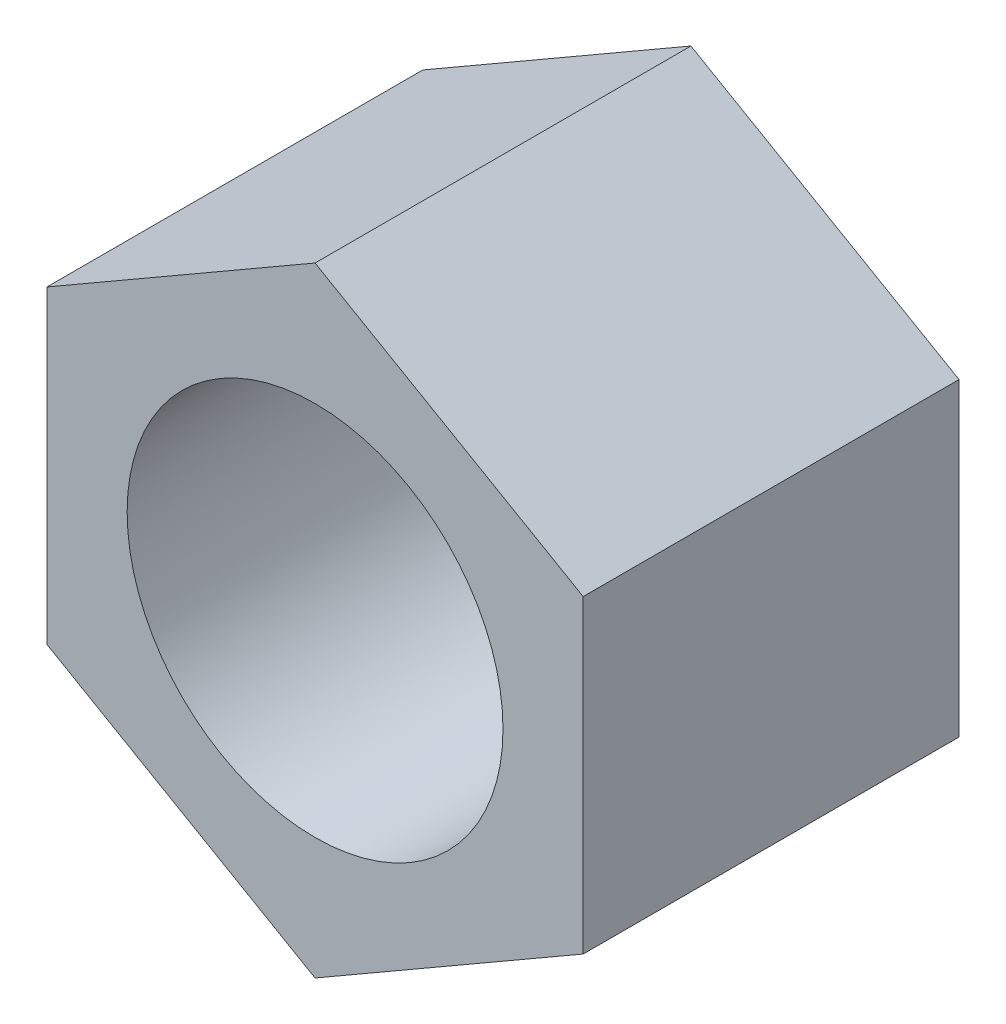
ISO-10303-21;
HEADER;
FILE_DESCRIPTION(('STEP AP214'),'2;1');
FILE_NAME('part.step','',(''),(''),'','','');
FILE_SCHEMA(('AUTOMOTIVE_DESIGN { 1 0 10303 214 1 1 1 1 }'));
ENDSEC;
DATA;
#1=APPLICATION_CONTEXT('core data for automotive mechanical design processes');
#2=APPLICATION_PROTOCOL_DEFINITION('international standard','automotive_design',2000,#1);
#3=PRODUCT_CONTEXT('',#1,'mechanical');
#4=PRODUCT('Part','Part','',(#3));
#5=PRODUCT_RELATED_PRODUCT_CATEGORY('part','',(#4));
#6=PRODUCT_DEFINITION_FORMATION('','',#4);
#7=PRODUCT_DEFINITION_CONTEXT('part definition',#1,'design');
#8=PRODUCT_DEFINITION('design','',#6,#7);
#9=PRODUCT_DEFINITION_SHAPE('','',#8);
#10=(LENGTH_UNIT() NAMED_UNIT(*) SI_UNIT(.MILLI.,.METRE.));
#11=(NAMED_UNIT(*) PLANE_ANGLE_UNIT() SI_UNIT($,.RADIAN.));
#12=(NAMED_UNIT(*) SI_UNIT($,.STERADIAN.) SOLID_ANGLE_UNIT());
#13=UNCERTAINTY_MEASURE_WITH_UNIT(LENGTH_MEASURE(1.E-05),#10,'distance_accuracy_value','');
#14=(GEOMETRIC_REPRESENTATION_CONTEXT(3) GLOBAL_UNCERTAINTY_ASSIGNED_CONTEXT((#13)) GLOBAL_UNIT_ASSIGNED_CONTEXT((#10,
#11,#12)) REPRESENTATION_CONTEXT('',''));
#15=CARTESIAN_POINT('',(0.,0.,0.));
#16=DIRECTION('',(0.,0.,1.));
#17=DIRECTION('',(1.,0.,0.));
#18=AXIS2_PLACEMENT_3D('',#15,#16,#17);
#19=CARTESIAN_POINT('',(0.,0.,6.));
#20=DIRECTION('',(0.,0.,1.));
#21=DIRECTION('',(1.,0.,0.));
#22=AXIS2_PLACEMENT_3D('',#19,#20,#21);
#23=PLANE('',#22);
#24=DIRECTION('',(0.866025403784442,-0.499999999999995,0.));
#25=VECTOR('',#24,1.);
#26=CARTESIAN_POINT('',(-4.28002451059541,-2.47107330333052,6.));
#27=LINE('',#26,#25);
#28=CARTESIAN_POINT('',(-4.28002451059541,-2.47107330333052,6.));
#29=VERTEX_POINT('',#28);
#30=CARTESIAN_POINT('',(0.,-4.94214660666094,6.));
#31=VERTEX_POINT('',#30);
#32=EDGE_CURVE('E131',#29,#31,#27,.T.);
#33=ORIENTED_EDGE('',*,*,#32,.T.);
#34=DIRECTION('',(0.866025403784438,0.500000000000001,0.));
#35=VECTOR('',#34,1.);
#36=CARTESIAN_POINT('',(0.,-4.94214660666094,6.));
#37=LINE('',#36,#35);
#38=CARTESIAN_POINT('',(4.28002451059544,-2.47107330333046,6.));
#39=VERTEX_POINT('',#38);
#40=EDGE_CURVE('E89',#31,#39,#37,.T.);
#41=ORIENTED_EDGE('',*,*,#40,.T.);
#42=DIRECTION('',(0.,1.,0.));
#43=VECTOR('',#42,1.);
#44=CARTESIAN_POINT('',(4.28002451059544,-2.47107330333046,6.));
#45=LINE('',#44,#43);
#46=CARTESIAN_POINT('',(4.28002451059543,2.47107330333049,6.));
#47=VERTEX_POINT('',#46);
#48=EDGE_CURVE('E102',#39,#47,#45,.T.);
#49=ORIENTED_EDGE('',*,*,#48,.T.);
#50=DIRECTION('',(-0.866025403784442,0.499999999999995,0.));
#51=VECTOR('',#50,1.);
#52=CARTESIAN_POINT('',(4.28002451059543,2.47107330333049,6.));
#53=LINE('',#52,#51);
#54=CARTESIAN_POINT('',(0.,4.94214660666094,6.));
#55=VERTEX_POINT('',#54);
#56=EDGE_CURVE('E96',#47,#55,#53,.T.);
#57=ORIENTED_EDGE('',*,*,#56,.T.);
#58=DIRECTION('',(-0.866025403784435,-0.500000000000007,0.));
#59=VECTOR('',#58,1.);
#60=CARTESIAN_POINT('',(0.,4.94214660666094,6.));
#61=LINE('',#60,#59);
#62=CARTESIAN_POINT('',(-4.28002451059546,2.47107330333043,6.));
#63=VERTEX_POINT('',#62);
#64=EDGE_CURVE('E100',#55,#63,#61,.T.);
#65=ORIENTED_EDGE('',*,*,#64,.T.);
#66=DIRECTION('',(0.,-1.,0.));
#67=VECTOR('',#66,1.);
#68=CARTESIAN_POINT('',(-4.28002451059546,2.47107330333043,6.));
#69=LINE('',#68,#67);
#70=EDGE_CURVE('E52',#63,#29,#69,.T.);
#71=ORIENTED_EDGE('',*,*,#70,.T.);
#72=EDGE_LOOP('',(#33,#41,#49,#57,#65,#71));
#73=FACE_BOUND('',#72,.T.);
#74=CARTESIAN_POINT('',(0.,0.,6.));
#75=DIRECTION('',(0.,0.,1.));
#76=DIRECTION('',(1.,0.,0.));
#77=AXIS2_PLACEMENT_3D('',#74,#75,#76);
#78=CIRCLE('',#77,3.);
#79=CARTESIAN_POINT('',(3.,0.,6.));
#80=VERTEX_POINT('',#79);
#81=EDGE_CURVE('E124',#80,#80,#78,.T.);
#82=ORIENTED_EDGE('',*,*,#81,.F.);
#83=EDGE_LOOP('',(#82));
#84=FACE_BOUND('',#83,.T.);
#85=ADVANCED_FACE('F35',(#73,#84),#23,.T.);
#86=CARTESIAN_POINT('',(0.,0.,0.));
#87=DIRECTION('',(0.,0.,1.));
#88=DIRECTION('',(1.,0.,0.));
#89=AXIS2_PLACEMENT_3D('',#86,#87,#88);
#90=PLANE('',#89);
#91=DIRECTION('',(0.866025403784442,-0.499999999999995,0.));
#92=VECTOR('',#91,1.);
#93=CARTESIAN_POINT('',(-4.28002451059541,-2.47107330333052,0.));
#94=LINE('',#93,#92);
#95=CARTESIAN_POINT('',(-4.28002451059541,-2.47107330333052,0.));
#96=VERTEX_POINT('',#95);
#97=CARTESIAN_POINT('',(0.,-4.94214660666094,0.));
#98=VERTEX_POINT('',#97);
#99=EDGE_CURVE('E120',#96,#98,#94,.T.);
#100=ORIENTED_EDGE('',*,*,#99,.F.);
#101=DIRECTION('',(0.,-1.,0.));
#102=VECTOR('',#101,1.);
#103=CARTESIAN_POINT('',(-4.28002451059546,2.47107330333043,0.));
#104=LINE('',#103,#102);
#105=CARTESIAN_POINT('',(-4.28002451059546,2.47107330333043,0.));
#106=VERTEX_POINT('',#105);
#107=EDGE_CURVE('E81',#106,#96,#104,.T.);
#108=ORIENTED_EDGE('',*,*,#107,.F.);
#109=DIRECTION('',(-0.866025403784435,-0.500000000000007,0.));
#110=VECTOR('',#109,1.);
#111=CARTESIAN_POINT('',(0.,4.94214660666094,0.));
#112=LINE('',#111,#110);
#113=CARTESIAN_POINT('',(0.,4.94214660666094,0.));
#114=VERTEX_POINT('',#113);
#115=EDGE_CURVE('E75',#114,#106,#112,.T.);
#116=ORIENTED_EDGE('',*,*,#115,.F.);
#117=DIRECTION('',(-0.866025403784442,0.499999999999995,0.));
#118=VECTOR('',#117,1.);
#119=CARTESIAN_POINT('',(4.28002451059543,2.47107330333049,0.));
#120=LINE('',#119,#118);
#121=CARTESIAN_POINT('',(4.28002451059543,2.47107330333049,0.));
#122=VERTEX_POINT('',#121);
#123=EDGE_CURVE('E110',#122,#114,#120,.T.);
#124=ORIENTED_EDGE('',*,*,#123,.F.);
#125=DIRECTION('',(0.,1.,0.));
#126=VECTOR('',#125,1.);
#127=CARTESIAN_POINT('',(4.28002451059544,-2.47107330333046,0.));
#128=LINE('',#127,#126);
#129=CARTESIAN_POINT('',(4.28002451059544,-2.47107330333046,0.));
#130=VERTEX_POINT('',#129);
#131=EDGE_CURVE('E126',#130,#122,#128,.T.);
#132=ORIENTED_EDGE('',*,*,#131,.F.);
#133=DIRECTION('',(0.866025403784438,0.500000000000001,0.));
#134=VECTOR('',#133,1.);
#135=CARTESIAN_POINT('',(0.,-4.94214660666094,0.));
#136=LINE('',#135,#134);
#137=EDGE_CURVE('E123',#98,#130,#136,.T.);
#138=ORIENTED_EDGE('',*,*,#137,.F.);
#139=EDGE_LOOP('',(#100,#108,#116,#124,#132,#138));
#140=FACE_BOUND('',#139,.T.);
#141=CARTESIAN_POINT('',(0.,0.,0.));
#142=DIRECTION('',(0.,0.,1.));
#143=DIRECTION('',(1.,0.,0.));
#144=AXIS2_PLACEMENT_3D('',#141,#142,#143);
#145=CIRCLE('',#144,3.);
#146=CARTESIAN_POINT('',(3.,0.,0.));
#147=VERTEX_POINT('',#146);
#148=EDGE_CURVE('E224',#147,#147,#145,.T.);
#149=ORIENTED_EDGE('',*,*,#148,.T.);
#150=EDGE_LOOP('',(#149));
#151=FACE_BOUND('',#150,.T.);
#152=ADVANCED_FACE('F140',(#140,#151),#90,.F.);
#153=CARTESIAN_POINT('',(-4.28002451059541,-2.47107330333052,6.));
#154=DIRECTION('',(0.499999999999995,0.866025403784441,0.));
#155=DIRECTION('',(-0.866025403784442,0.499999999999995,0.));
#156=AXIS2_PLACEMENT_3D('',#153,#154,#155);
#157=PLANE('',#156);
#158=ORIENTED_EDGE('',*,*,#99,.T.);
#159=DIRECTION('',(0.,0.,-1.));
#160=VECTOR('',#159,1.);
#161=CARTESIAN_POINT('',(0.,-4.94214660666094,6.));
#162=LINE('',#161,#160);
#163=EDGE_CURVE('E11',#31,#98,#162,.T.);
#164=ORIENTED_EDGE('',*,*,#163,.F.);
#165=ORIENTED_EDGE('',*,*,#32,.F.);
#166=DIRECTION('',(0.,0.,-1.));
#167=VECTOR('',#166,1.);
#168=CARTESIAN_POINT('',(-4.28002451059541,-2.47107330333052,6.));
#169=LINE('',#168,#167);
#170=EDGE_CURVE('E116',#29,#96,#169,.T.);
#171=ORIENTED_EDGE('',*,*,#170,.T.);
#172=EDGE_LOOP('',(#158,#164,#165,#171));
#173=FACE_BOUND('',#172,.T.);
#174=ADVANCED_FACE('F37',(#173),#157,.F.);
#175=CARTESIAN_POINT('',(0.,-4.94214660666094,6.));
#176=DIRECTION('',(-0.500000000000001,0.866025403784438,0.));
#177=DIRECTION('',(-0.866025403784438,-0.500000000000001,0.));
#178=AXIS2_PLACEMENT_3D('',#175,#176,#177);
#179=PLANE('',#178);
#180=ORIENTED_EDGE('',*,*,#137,.T.);
#181=DIRECTION('',(0.,0.,-1.));
#182=VECTOR('',#181,1.);
#183=CARTESIAN_POINT('',(4.28002451059544,-2.47107330333046,6.));
#184=LINE('',#183,#182);
#185=EDGE_CURVE('E44',#39,#130,#184,.T.);
#186=ORIENTED_EDGE('',*,*,#185,.F.);
#187=ORIENTED_EDGE('',*,*,#40,.F.);
#188=ORIENTED_EDGE('',*,*,#163,.T.);
#189=EDGE_LOOP('',(#180,#186,#187,#188));
#190=FACE_BOUND('',#189,.T.);
#191=ADVANCED_FACE('F165',(#190),#179,.F.);
#192=CARTESIAN_POINT('',(4.28002451059544,-2.47107330333046,6.));
#193=DIRECTION('',(-1.,0.,0.));
#194=DIRECTION('',(0.,-1.,0.));
#195=AXIS2_PLACEMENT_3D('',#192,#193,#194);
#196=PLANE('',#195);
#197=ORIENTED_EDGE('',*,*,#131,.T.);
#198=DIRECTION('',(0.,0.,-1.));
#199=VECTOR('',#198,1.);
#200=CARTESIAN_POINT('',(4.28002451059543,2.47107330333049,6.));
#201=LINE('',#200,#199);
#202=EDGE_CURVE('E111',#47,#122,#201,.T.);
#203=ORIENTED_EDGE('',*,*,#202,.F.);
#204=ORIENTED_EDGE('',*,*,#48,.F.);
#205=ORIENTED_EDGE('',*,*,#185,.T.);
#206=EDGE_LOOP('',(#197,#203,#204,#205));
#207=FACE_BOUND('',#206,.T.);
#208=ADVANCED_FACE('F137',(#207),#196,.F.);
#209=CARTESIAN_POINT('',(4.28002451059543,2.47107330333049,6.));
#210=DIRECTION('',(-0.499999999999995,-0.866025403784442,0.));
#211=DIRECTION('',(0.866025403784442,-0.499999999999995,0.));
#212=AXIS2_PLACEMENT_3D('',#209,#210,#211);
#213=PLANE('',#212);
#214=ORIENTED_EDGE('',*,*,#123,.T.);
#215=DIRECTION('',(0.,0.,-1.));
#216=VECTOR('',#215,1.);
#217=CARTESIAN_POINT('',(0.,4.94214660666094,6.));
#218=LINE('',#217,#216);
#219=EDGE_CURVE('E107',#55,#114,#218,.T.);
#220=ORIENTED_EDGE('',*,*,#219,.F.);
#221=ORIENTED_EDGE('',*,*,#56,.F.);
#222=ORIENTED_EDGE('',*,*,#202,.T.);
#223=EDGE_LOOP('',(#214,#220,#221,#222));
#224=FACE_BOUND('',#223,.T.);
#225=ADVANCED_FACE('F108',(#224),#213,.F.);
#226=CARTESIAN_POINT('',(0.,4.94214660666094,6.));
#227=DIRECTION('',(0.500000000000007,-0.866025403784434,0.));
#228=DIRECTION('',(0.866025403784435,0.500000000000007,0.));
#229=AXIS2_PLACEMENT_3D('',#226,#227,#228);
#230=PLANE('',#229);
#231=ORIENTED_EDGE('',*,*,#115,.T.);
#232=DIRECTION('',(0.,0.,-1.));
#233=VECTOR('',#232,1.);
#234=CARTESIAN_POINT('',(-4.28002451059546,2.47107330333043,6.));
#235=LINE('',#234,#233);
#236=EDGE_CURVE('E112',#63,#106,#235,.T.);
#237=ORIENTED_EDGE('',*,*,#236,.F.);
#238=ORIENTED_EDGE('',*,*,#64,.F.);
#239=ORIENTED_EDGE('',*,*,#219,.T.);
#240=EDGE_LOOP('',(#231,#237,#238,#239));
#241=FACE_BOUND('',#240,.T.);
#242=ADVANCED_FACE('F114',(#241),#230,.F.);
#243=CARTESIAN_POINT('',(-4.28002451059546,2.47107330333043,6.));
#244=DIRECTION('',(1.,0.,0.));
#245=DIRECTION('',(0.,1.,0.));
#246=AXIS2_PLACEMENT_3D('',#243,#244,#245);
#247=PLANE('',#246);
#248=ORIENTED_EDGE('',*,*,#107,.T.);
#249=ORIENTED_EDGE('',*,*,#170,.F.);
#250=ORIENTED_EDGE('',*,*,#70,.F.);
#251=ORIENTED_EDGE('',*,*,#236,.T.);
#252=EDGE_LOOP('',(#248,#249,#250,#251));
#253=FACE_BOUND('',#252,.T.);
#254=ADVANCED_FACE('F145',(#253),#247,.F.);
#255=CARTESIAN_POINT('',(0.,0.,6.));
#256=DIRECTION('',(0.,0.,-1.));
#257=DIRECTION('',(-1.,0.,0.));
#258=AXIS2_PLACEMENT_3D('',#255,#256,#257);
#259=CYLINDRICAL_SURFACE('',#258,3.);
#260=ORIENTED_EDGE('',*,*,#81,.T.);
#261=EDGE_LOOP('',(#260));
#262=FACE_BOUND('',#261,.T.);
#263=ORIENTED_EDGE('',*,*,#148,.F.);
#264=EDGE_LOOP('',(#263));
#265=FACE_BOUND('',#264,.T.);
#266=ADVANCED_FACE('F147',(#262,#265),#259,.F.);
#267=CLOSED_SHELL('',(#85,#152,#174,#191,#208,#225,#242,#254,#266));
#268=MANIFOLD_SOLID_BREP('B2',#267);
#269=ADVANCED_BREP_SHAPE_REPRESENTATION('',(#18,#268),#14);
#270=SHAPE_DEFINITION_REPRESENTATION(#9,#269);
ENDSEC;
END-ISO-10303-21;
